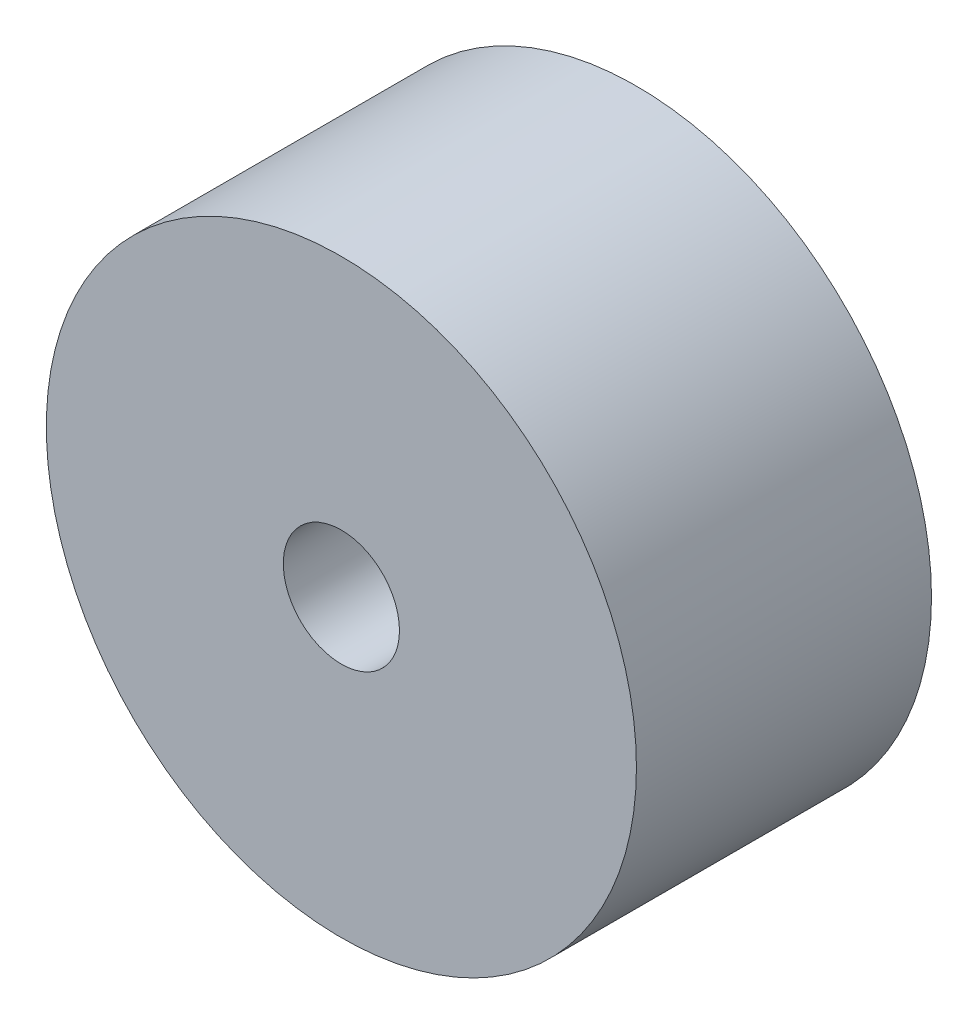
ISO-10303-21;
HEADER;
FILE_DESCRIPTION(('STEP AP214'),'2;1');
FILE_NAME('part.step','',(''),(''),'','','');
FILE_SCHEMA(('AUTOMOTIVE_DESIGN { 1 0 10303 214 1 1 1 1 }'));
ENDSEC;
DATA;
#1=APPLICATION_CONTEXT('core data for automotive mechanical design processes');
#2=APPLICATION_PROTOCOL_DEFINITION('international standard','automotive_design',2000,#1);
#3=PRODUCT_CONTEXT('',#1,'mechanical');
#4=PRODUCT('Part','Part','',(#3));
#5=PRODUCT_RELATED_PRODUCT_CATEGORY('part','',(#4));
#6=PRODUCT_DEFINITION_FORMATION('','',#4);
#7=PRODUCT_DEFINITION_CONTEXT('part definition',#1,'design');
#8=PRODUCT_DEFINITION('design','',#6,#7);
#9=PRODUCT_DEFINITION_SHAPE('','',#8);
#10=(LENGTH_UNIT() NAMED_UNIT(*) SI_UNIT(.MILLI.,.METRE.));
#11=(NAMED_UNIT(*) PLANE_ANGLE_UNIT() SI_UNIT($,.RADIAN.));
#12=(NAMED_UNIT(*) SI_UNIT($,.STERADIAN.) SOLID_ANGLE_UNIT());
#13=UNCERTAINTY_MEASURE_WITH_UNIT(LENGTH_MEASURE(1.E-05),#10,'distance_accuracy_value','');
#14=(GEOMETRIC_REPRESENTATION_CONTEXT(3) GLOBAL_UNCERTAINTY_ASSIGNED_CONTEXT((#13)) GLOBAL_UNIT_ASSIGNED_CONTEXT((#10,
#11,#12)) REPRESENTATION_CONTEXT('',''));
#15=CARTESIAN_POINT('',(0.,0.,0.));
#16=DIRECTION('',(0.,0.,1.));
#17=DIRECTION('',(1.,0.,0.));
#18=AXIS2_PLACEMENT_3D('',#15,#16,#17);
#19=CARTESIAN_POINT('',(0.,0.,12.7));
#20=DIRECTION('',(0.,0.,-1.));
#21=DIRECTION('',(-1.,0.,0.));
#22=AXIS2_PLACEMENT_3D('',#19,#20,#21);
#23=CYLINDRICAL_SURFACE('',#22,12.7);
#24=CARTESIAN_POINT('',(0.,0.,12.7));
#25=DIRECTION('',(0.,0.,1.));
#26=DIRECTION('',(1.,0.,0.));
#27=AXIS2_PLACEMENT_3D('',#24,#25,#26);
#28=CIRCLE('',#27,12.7);
#29=CARTESIAN_POINT('',(12.7,0.,12.7));
#30=VERTEX_POINT('',#29);
#31=EDGE_CURVE('E10',#30,#30,#28,.T.);
#32=ORIENTED_EDGE('',*,*,#31,.F.);
#33=EDGE_LOOP('',(#32));
#34=FACE_BOUND('',#33,.T.);
#35=CARTESIAN_POINT('',(0.,0.,0.));
#36=DIRECTION('',(0.,0.,1.));
#37=DIRECTION('',(1.,0.,0.));
#38=AXIS2_PLACEMENT_3D('',#35,#36,#37);
#39=CIRCLE('',#38,12.7);
#40=CARTESIAN_POINT('',(12.7,0.,0.));
#41=VERTEX_POINT('',#40);
#42=EDGE_CURVE('E46',#41,#41,#39,.T.);
#43=ORIENTED_EDGE('',*,*,#42,.T.);
#44=EDGE_LOOP('',(#43));
#45=FACE_BOUND('',#44,.T.);
#46=ADVANCED_FACE('F39',(#34,#45),#23,.T.);
#47=CARTESIAN_POINT('',(0.,0.,12.7));
#48=DIRECTION('',(0.,0.,1.));
#49=DIRECTION('',(1.,0.,0.));
#50=AXIS2_PLACEMENT_3D('',#47,#48,#49);
#51=PLANE('',#50);
#52=CARTESIAN_POINT('',(0.,0.,12.7));
#53=DIRECTION('',(0.,0.,1.));
#54=DIRECTION('',(1.,0.,0.));
#55=AXIS2_PLACEMENT_3D('',#52,#53,#54);
#56=CIRCLE('',#55,2.5);
#57=CARTESIAN_POINT('',(2.5,0.,12.7));
#58=VERTEX_POINT('',#57);
#59=EDGE_CURVE('E52',#58,#58,#56,.T.);
#60=ORIENTED_EDGE('',*,*,#59,.F.);
#61=EDGE_LOOP('',(#60));
#62=FACE_BOUND('',#61,.T.);
#63=ORIENTED_EDGE('',*,*,#31,.T.);
#64=EDGE_LOOP('',(#63));
#65=FACE_BOUND('',#64,.T.);
#66=ADVANCED_FACE('F68',(#62,#65),#51,.T.);
#67=CARTESIAN_POINT('',(0.,0.,0.));
#68=DIRECTION('',(0.,0.,1.));
#69=DIRECTION('',(1.,0.,0.));
#70=AXIS2_PLACEMENT_3D('',#67,#68,#69);
#71=PLANE('',#70);
#72=CARTESIAN_POINT('',(0.,0.,0.));
#73=DIRECTION('',(0.,0.,1.));
#74=DIRECTION('',(1.,0.,0.));
#75=AXIS2_PLACEMENT_3D('',#72,#73,#74);
#76=CIRCLE('',#75,2.5);
#77=CARTESIAN_POINT('',(2.5,0.,0.));
#78=VERTEX_POINT('',#77);
#79=EDGE_CURVE('E42',#78,#78,#76,.T.);
#80=ORIENTED_EDGE('',*,*,#79,.T.);
#81=EDGE_LOOP('',(#80));
#82=FACE_BOUND('',#81,.T.);
#83=ORIENTED_EDGE('',*,*,#42,.F.);
#84=EDGE_LOOP('',(#83));
#85=FACE_BOUND('',#84,.T.);
#86=ADVANCED_FACE('F59',(#82,#85),#71,.F.);
#87=CARTESIAN_POINT('',(0.,0.,-3.3));
#88=DIRECTION('',(0.,0.,1.));
#89=DIRECTION('',(1.,0.,0.));
#90=AXIS2_PLACEMENT_3D('',#87,#88,#89);
#91=CYLINDRICAL_SURFACE('',#90,2.5);
#92=ORIENTED_EDGE('',*,*,#59,.T.);
#93=EDGE_LOOP('',(#92));
#94=FACE_BOUND('',#93,.T.);
#95=ORIENTED_EDGE('',*,*,#79,.F.);
#96=EDGE_LOOP('',(#95));
#97=FACE_BOUND('',#96,.T.);
#98=ADVANCED_FACE('F62',(#94,#97),#91,.F.);
#99=CLOSED_SHELL('',(#46,#66,#86,#98));
#100=MANIFOLD_SOLID_BREP('B2',#99);
#101=ADVANCED_BREP_SHAPE_REPRESENTATION('',(#18,#100),#14);
#102=SHAPE_DEFINITION_REPRESENTATION(#9,#101);
ENDSEC;
END-ISO-10303-21;
